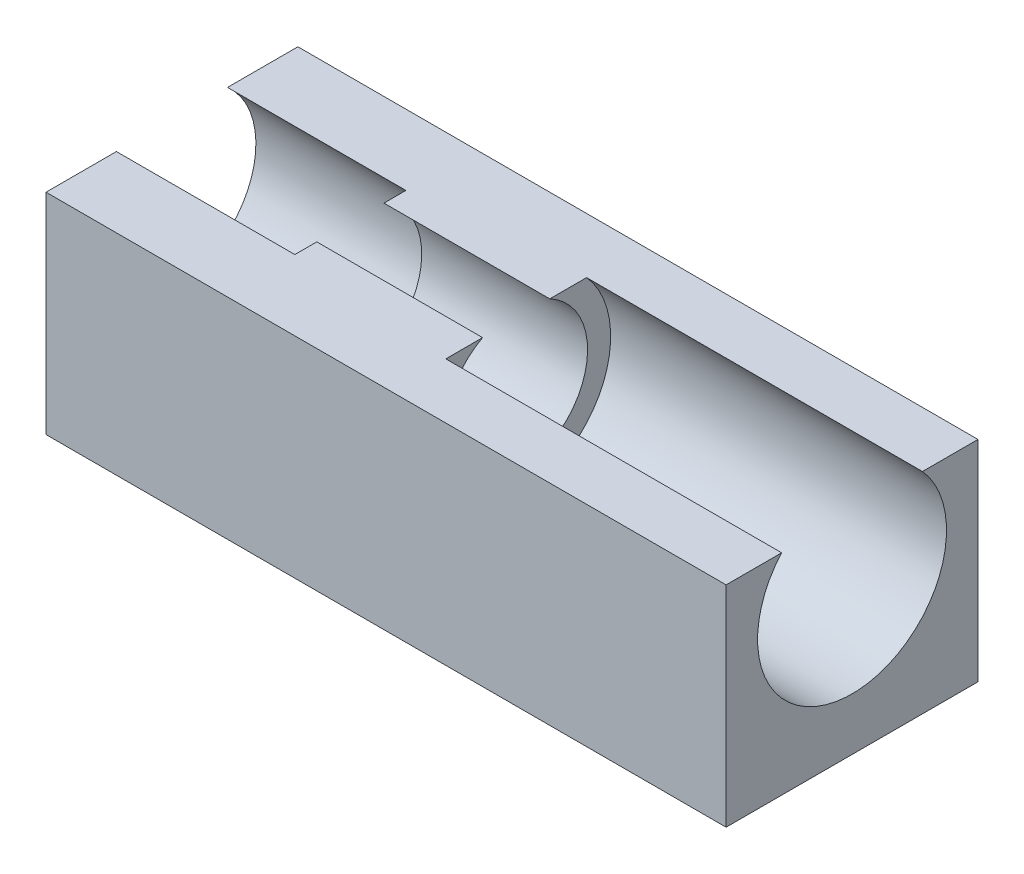
ISO-10303-21;
HEADER;
FILE_DESCRIPTION(('STEP AP214'),'2;1');
FILE_NAME('part.step','',(''),(''),'','','');
FILE_SCHEMA(('AUTOMOTIVE_DESIGN { 1 0 10303 214 1 1 1 1 }'));
ENDSEC;
DATA;
#1=APPLICATION_CONTEXT('core data for automotive mechanical design processes');
#2=APPLICATION_PROTOCOL_DEFINITION('international standard','automotive_design',2000,#1);
#3=PRODUCT_CONTEXT('',#1,'mechanical');
#4=PRODUCT('Part','Part','',(#3));
#5=PRODUCT_RELATED_PRODUCT_CATEGORY('part','',(#4));
#6=PRODUCT_DEFINITION_FORMATION('','',#4);
#7=PRODUCT_DEFINITION_CONTEXT('part definition',#1,'design');
#8=PRODUCT_DEFINITION('design','',#6,#7);
#9=PRODUCT_DEFINITION_SHAPE('','',#8);
#10=(LENGTH_UNIT() NAMED_UNIT(*) SI_UNIT(.MILLI.,.METRE.));
#11=(NAMED_UNIT(*) PLANE_ANGLE_UNIT() SI_UNIT($,.RADIAN.));
#12=(NAMED_UNIT(*) SI_UNIT($,.STERADIAN.) SOLID_ANGLE_UNIT());
#13=UNCERTAINTY_MEASURE_WITH_UNIT(LENGTH_MEASURE(1.E-05),#10,'distance_accuracy_value','');
#14=(GEOMETRIC_REPRESENTATION_CONTEXT(3) GLOBAL_UNCERTAINTY_ASSIGNED_CONTEXT((#13)) GLOBAL_UNIT_ASSIGNED_CONTEXT((#10,
#11,#12)) REPRESENTATION_CONTEXT('',''));
#15=CARTESIAN_POINT('',(0.,0.,0.));
#16=DIRECTION('',(0.,0.,1.));
#17=DIRECTION('',(1.,0.,0.));
#18=AXIS2_PLACEMENT_3D('',#15,#16,#17);
#19=CARTESIAN_POINT('',(0.,10.,0.));
#20=DIRECTION('',(0.,1.,0.));
#21=DIRECTION('',(0.,0.,1.));
#22=AXIS2_PLACEMENT_3D('',#19,#20,#21);
#23=PLANE('',#22);
#24=DIRECTION('',(1.,0.,0.));
#25=VECTOR('',#24,1.);
#26=CARTESIAN_POINT('',(0.199999999999991,10.,3.35410196624969));
#27=LINE('',#26,#25);
#28=CARTESIAN_POINT('',(0.199999999999991,10.,3.35410196624969));
#29=VERTEX_POINT('',#28);
#30=CARTESIAN_POINT('',(16.2,10.,3.35410196624969));
#31=VERTEX_POINT('',#30);
#32=EDGE_CURVE('E11',#29,#31,#27,.T.);
#33=ORIENTED_EDGE('',*,*,#32,.F.);
#34=DIRECTION('',(0.,0.,-1.));
#35=VECTOR('',#34,1.);
#36=CARTESIAN_POINT('',(0.199999999999992,10.,0.));
#37=LINE('',#36,#35);
#38=CARTESIAN_POINT('',(0.199999999999991,10.,1.6));
#39=VERTEX_POINT('',#38);
#40=EDGE_CURVE('E126',#29,#39,#37,.T.);
#41=ORIENTED_EDGE('',*,*,#40,.T.);
#42=DIRECTION('',(-1.,0.,0.));
#43=VECTOR('',#42,1.);
#44=CARTESIAN_POINT('',(0.199999999999999,10.,1.6));
#45=LINE('',#44,#43);
#46=CARTESIAN_POINT('',(-7.7,10.,1.6));
#47=VERTEX_POINT('',#46);
#48=EDGE_CURVE('E135',#47,#39,#45,.F.);
#49=ORIENTED_EDGE('',*,*,#48,.F.);
#50=DIRECTION('',(0.,0.,1.));
#51=VECTOR('',#50,1.);
#52=CARTESIAN_POINT('',(-7.7,10.,0.));
#53=LINE('',#52,#51);
#54=CARTESIAN_POINT('',(-7.7,10.,2.64575131106459));
#55=VERTEX_POINT('',#54);
#56=EDGE_CURVE('E56',#47,#55,#53,.T.);
#57=ORIENTED_EDGE('',*,*,#56,.T.);
#58=DIRECTION('',(-1.,0.,0.));
#59=VECTOR('',#58,1.);
#60=CARTESIAN_POINT('',(-7.7,10.,2.64575131106459));
#61=LINE('',#60,#59);
#62=CARTESIAN_POINT('',(-16.2,10.,2.64575131106459));
#63=VERTEX_POINT('',#62);
#64=EDGE_CURVE('E178',#63,#55,#61,.F.);
#65=ORIENTED_EDGE('',*,*,#64,.F.);
#66=DIRECTION('',(0.,0.,1.));
#67=VECTOR('',#66,1.);
#68=CARTESIAN_POINT('',(-16.2,10.,-6.));
#69=LINE('',#68,#67);
#70=CARTESIAN_POINT('',(-16.2,10.,6.));
#71=VERTEX_POINT('',#70);
#72=EDGE_CURVE('E150',#63,#71,#69,.T.);
#73=ORIENTED_EDGE('',*,*,#72,.T.);
#74=DIRECTION('',(1.,0.,0.));
#75=VECTOR('',#74,1.);
#76=CARTESIAN_POINT('',(-16.2,10.,6.));
#77=LINE('',#76,#75);
#78=CARTESIAN_POINT('',(16.2,10.,6.));
#79=VERTEX_POINT('',#78);
#80=EDGE_CURVE('E154',#71,#79,#77,.T.);
#81=ORIENTED_EDGE('',*,*,#80,.T.);
#82=DIRECTION('',(0.,0.,-1.));
#83=VECTOR('',#82,1.);
#84=CARTESIAN_POINT('',(16.2,10.,-6.));
#85=LINE('',#84,#83);
#86=EDGE_CURVE('E144',#79,#31,#85,.T.);
#87=ORIENTED_EDGE('',*,*,#86,.T.);
#88=EDGE_LOOP('',(#33,#41,#49,#57,#65,#73,#81,#87));
#89=FACE_BOUND('',#88,.T.);
#90=ADVANCED_FACE('F33',(#89),#23,.T.);
#91=CARTESIAN_POINT('',(16.2,10.,-6.));
#92=DIRECTION('',(-1.,0.,0.));
#93=DIRECTION('',(0.,0.,1.));
#94=AXIS2_PLACEMENT_3D('',#91,#92,#93);
#95=PLANE('',#94);
#96=CARTESIAN_POINT('',(16.2,10.,-3.35410196624967));
#97=VERTEX_POINT('',#96);
#98=CARTESIAN_POINT('',(16.2,10.,-6.));
#99=VERTEX_POINT('',#98);
#100=EDGE_CURVE('E148',#97,#99,#85,.T.);
#101=ORIENTED_EDGE('',*,*,#100,.F.);
#102=CARTESIAN_POINT('',(16.2,7.,0.));
#103=DIRECTION('',(1.,0.,0.));
#104=DIRECTION('',(0.,0.,-1.));
#105=AXIS2_PLACEMENT_3D('',#102,#103,#104);
#106=CIRCLE('',#105,4.5);
#107=EDGE_CURVE('E117',#31,#97,#106,.T.);
#108=ORIENTED_EDGE('',*,*,#107,.F.);
#109=ORIENTED_EDGE('',*,*,#86,.F.);
#110=DIRECTION('',(0.,-1.,0.));
#111=VECTOR('',#110,1.);
#112=CARTESIAN_POINT('',(16.2,10.,6.));
#113=LINE('',#112,#111);
#114=CARTESIAN_POINT('',(16.2,0.,6.));
#115=VERTEX_POINT('',#114);
#116=EDGE_CURVE('E156',#79,#115,#113,.T.);
#117=ORIENTED_EDGE('',*,*,#116,.T.);
#118=DIRECTION('',(0.,0.,-1.));
#119=VECTOR('',#118,1.);
#120=CARTESIAN_POINT('',(16.2,0.,-6.));
#121=LINE('',#120,#119);
#122=CARTESIAN_POINT('',(16.2,0.,-6.));
#123=VERTEX_POINT('',#122);
#124=EDGE_CURVE('E142',#115,#123,#121,.T.);
#125=ORIENTED_EDGE('',*,*,#124,.T.);
#126=DIRECTION('',(0.,-1.,0.));
#127=VECTOR('',#126,1.);
#128=CARTESIAN_POINT('',(16.2,10.,-6.));
#129=LINE('',#128,#127);
#130=EDGE_CURVE('E173',#99,#123,#129,.T.);
#131=ORIENTED_EDGE('',*,*,#130,.F.);
#132=EDGE_LOOP('',(#101,#108,#109,#117,#125,#131));
#133=FACE_BOUND('',#132,.T.);
#134=ADVANCED_FACE('F35',(#133),#95,.F.);
#135=CARTESIAN_POINT('',(-16.2,10.,-6.));
#136=DIRECTION('',(0.,0.,1.));
#137=DIRECTION('',(1.,0.,0.));
#138=AXIS2_PLACEMENT_3D('',#135,#136,#137);
#139=PLANE('',#138);
#140=DIRECTION('',(-1.,0.,0.));
#141=VECTOR('',#140,1.);
#142=CARTESIAN_POINT('',(-16.2,0.,-6.));
#143=LINE('',#142,#141);
#144=CARTESIAN_POINT('',(-16.2,0.,-6.));
#145=VERTEX_POINT('',#144);
#146=EDGE_CURVE('E159',#123,#145,#143,.T.);
#147=ORIENTED_EDGE('',*,*,#146,.T.);
#148=DIRECTION('',(0.,-1.,0.));
#149=VECTOR('',#148,1.);
#150=CARTESIAN_POINT('',(-16.2,10.,-6.));
#151=LINE('',#150,#149);
#152=CARTESIAN_POINT('',(-16.2,10.,-6.));
#153=VERTEX_POINT('',#152);
#154=EDGE_CURVE('E170',#153,#145,#151,.T.);
#155=ORIENTED_EDGE('',*,*,#154,.F.);
#156=DIRECTION('',(-1.,0.,0.));
#157=VECTOR('',#156,1.);
#158=CARTESIAN_POINT('',(-16.2,10.,-6.));
#159=LINE('',#158,#157);
#160=EDGE_CURVE('E147',#99,#153,#159,.T.);
#161=ORIENTED_EDGE('',*,*,#160,.F.);
#162=ORIENTED_EDGE('',*,*,#130,.T.);
#163=EDGE_LOOP('',(#147,#155,#161,#162));
#164=FACE_BOUND('',#163,.T.);
#165=ADVANCED_FACE('F209',(#164),#139,.F.);
#166=CARTESIAN_POINT('',(-16.2,10.,-6.));
#167=DIRECTION('',(1.,0.,0.));
#168=DIRECTION('',(0.,0.,-1.));
#169=AXIS2_PLACEMENT_3D('',#166,#167,#168);
#170=PLANE('',#169);
#171=ORIENTED_EDGE('',*,*,#72,.F.);
#172=CARTESIAN_POINT('',(-16.2,7.,0.));
#173=DIRECTION('',(-1.,0.,0.));
#174=DIRECTION('',(0.,0.,1.));
#175=AXIS2_PLACEMENT_3D('',#172,#173,#174);
#176=CIRCLE('',#175,4.);
#177=CARTESIAN_POINT('',(-16.2,10.,-2.64575131106459));
#178=VERTEX_POINT('',#177);
#179=EDGE_CURVE('E139',#178,#63,#176,.T.);
#180=ORIENTED_EDGE('',*,*,#179,.F.);
#181=EDGE_CURVE('E151',#153,#178,#69,.T.);
#182=ORIENTED_EDGE('',*,*,#181,.F.);
#183=ORIENTED_EDGE('',*,*,#154,.T.);
#184=DIRECTION('',(0.,0.,1.));
#185=VECTOR('',#184,1.);
#186=CARTESIAN_POINT('',(-16.2,0.,-6.));
#187=LINE('',#186,#185);
#188=CARTESIAN_POINT('',(-16.2,0.,6.));
#189=VERTEX_POINT('',#188);
#190=EDGE_CURVE('E161',#145,#189,#187,.T.);
#191=ORIENTED_EDGE('',*,*,#190,.T.);
#192=DIRECTION('',(0.,-1.,0.));
#193=VECTOR('',#192,1.);
#194=CARTESIAN_POINT('',(-16.2,10.,6.));
#195=LINE('',#194,#193);
#196=EDGE_CURVE('E167',#71,#189,#195,.T.);
#197=ORIENTED_EDGE('',*,*,#196,.F.);
#198=EDGE_LOOP('',(#171,#180,#182,#183,#191,#197));
#199=FACE_BOUND('',#198,.T.);
#200=ADVANCED_FACE('F194',(#199),#170,.F.);
#201=CARTESIAN_POINT('',(-16.2,10.,6.));
#202=DIRECTION('',(0.,0.,-1.));
#203=DIRECTION('',(-1.,0.,0.));
#204=AXIS2_PLACEMENT_3D('',#201,#202,#203);
#205=PLANE('',#204);
#206=DIRECTION('',(1.,0.,0.));
#207=VECTOR('',#206,1.);
#208=CARTESIAN_POINT('',(-16.2,0.,6.));
#209=LINE('',#208,#207);
#210=EDGE_CURVE('E163',#189,#115,#209,.T.);
#211=ORIENTED_EDGE('',*,*,#210,.T.);
#212=ORIENTED_EDGE('',*,*,#116,.F.);
#213=ORIENTED_EDGE('',*,*,#80,.F.);
#214=ORIENTED_EDGE('',*,*,#196,.T.);
#215=EDGE_LOOP('',(#211,#212,#213,#214));
#216=FACE_BOUND('',#215,.T.);
#217=ADVANCED_FACE('F201',(#216),#205,.F.);
#218=DIRECTION('',(1.,0.,0.));
#219=VECTOR('',#218,1.);
#220=CARTESIAN_POINT('',(0.199999999999993,10.,-3.35410196624968));
#221=LINE('',#220,#219);
#222=CARTESIAN_POINT('',(0.199999999999993,10.,-3.35410196624968));
#223=VERTEX_POINT('',#222);
#224=EDGE_CURVE('E41',#97,#223,#221,.F.);
#225=ORIENTED_EDGE('',*,*,#224,.F.);
#226=ORIENTED_EDGE('',*,*,#100,.T.);
#227=ORIENTED_EDGE('',*,*,#160,.T.);
#228=ORIENTED_EDGE('',*,*,#181,.T.);
#229=DIRECTION('',(-1.,0.,0.));
#230=VECTOR('',#229,1.);
#231=CARTESIAN_POINT('',(-7.7,10.,-2.64575131106459));
#232=LINE('',#231,#230);
#233=CARTESIAN_POINT('',(-7.7,10.,-2.64575131106459));
#234=VERTEX_POINT('',#233);
#235=EDGE_CURVE('E181',#234,#178,#232,.T.);
#236=ORIENTED_EDGE('',*,*,#235,.F.);
#237=CARTESIAN_POINT('',(-7.7,10.,-1.6));
#238=VERTEX_POINT('',#237);
#239=EDGE_CURVE('E176',#234,#238,#53,.T.);
#240=ORIENTED_EDGE('',*,*,#239,.T.);
#241=DIRECTION('',(-1.,0.,0.));
#242=VECTOR('',#241,1.);
#243=CARTESIAN_POINT('',(0.199999999999999,10.,-1.6));
#244=LINE('',#243,#242);
#245=CARTESIAN_POINT('',(0.199999999999999,10.,-1.6));
#246=VERTEX_POINT('',#245);
#247=EDGE_CURVE('E48',#246,#238,#244,.T.);
#248=ORIENTED_EDGE('',*,*,#247,.F.);
#249=EDGE_CURVE('E124',#246,#223,#37,.T.);
#250=ORIENTED_EDGE('',*,*,#249,.T.);
#251=EDGE_LOOP('',(#225,#226,#227,#228,#236,#240,#248,#250));
#252=FACE_BOUND('',#251,.T.);
#253=ADVANCED_FACE('F128',(#252),#23,.T.);
#254=CARTESIAN_POINT('',(0.,0.,0.));
#255=DIRECTION('',(0.,1.,0.));
#256=DIRECTION('',(0.,0.,1.));
#257=AXIS2_PLACEMENT_3D('',#254,#255,#256);
#258=PLANE('',#257);
#259=ORIENTED_EDGE('',*,*,#124,.F.);
#260=ORIENTED_EDGE('',*,*,#210,.F.);
#261=ORIENTED_EDGE('',*,*,#190,.F.);
#262=ORIENTED_EDGE('',*,*,#146,.F.);
#263=EDGE_LOOP('',(#259,#260,#261,#262));
#264=FACE_BOUND('',#263,.T.);
#265=ADVANCED_FACE('F211',(#264),#258,.F.);
#266=CARTESIAN_POINT('',(-7.7,7.,0.));
#267=DIRECTION('',(-1.,0.,0.));
#268=DIRECTION('',(0.,0.,1.));
#269=AXIS2_PLACEMENT_3D('',#266,#267,#268);
#270=CYLINDRICAL_SURFACE('',#269,4.);
#271=ORIENTED_EDGE('',*,*,#235,.T.);
#272=ORIENTED_EDGE('',*,*,#179,.T.);
#273=ORIENTED_EDGE('',*,*,#64,.T.);
#274=CARTESIAN_POINT('',(-7.7,7.,0.));
#275=DIRECTION('',(-1.,0.,0.));
#276=DIRECTION('',(0.,0.,1.));
#277=AXIS2_PLACEMENT_3D('',#274,#275,#276);
#278=CIRCLE('',#277,4.);
#279=EDGE_CURVE('E140',#234,#55,#278,.T.);
#280=ORIENTED_EDGE('',*,*,#279,.F.);
#281=EDGE_LOOP('',(#271,#272,#273,#280));
#282=FACE_BOUND('',#281,.T.);
#283=ADVANCED_FACE('F189',(#282),#270,.F.);
#284=CARTESIAN_POINT('',(-7.7,7.,0.));
#285=DIRECTION('',(-1.,0.,0.));
#286=DIRECTION('',(0.,0.,1.));
#287=AXIS2_PLACEMENT_3D('',#284,#285,#286);
#288=PLANE('',#287);
#289=CARTESIAN_POINT('',(-7.7,7.,0.));
#290=DIRECTION('',(-1.,0.,0.));
#291=DIRECTION('',(0.,0.,1.));
#292=AXIS2_PLACEMENT_3D('',#289,#290,#291);
#293=CIRCLE('',#292,3.4);
#294=EDGE_CURVE('E121',#238,#47,#293,.T.);
#295=ORIENTED_EDGE('',*,*,#294,.F.);
#296=ORIENTED_EDGE('',*,*,#239,.F.);
#297=ORIENTED_EDGE('',*,*,#279,.T.);
#298=ORIENTED_EDGE('',*,*,#56,.F.);
#299=EDGE_LOOP('',(#295,#296,#297,#298));
#300=FACE_BOUND('',#299,.T.);
#301=ADVANCED_FACE('F185',(#300),#288,.T.);
#302=CARTESIAN_POINT('',(0.199999999999999,7.,0.));
#303=DIRECTION('',(-1.,0.,0.));
#304=DIRECTION('',(0.,0.,1.));
#305=AXIS2_PLACEMENT_3D('',#302,#303,#304);
#306=CYLINDRICAL_SURFACE('',#305,3.4);
#307=ORIENTED_EDGE('',*,*,#247,.T.);
#308=ORIENTED_EDGE('',*,*,#294,.T.);
#309=ORIENTED_EDGE('',*,*,#48,.T.);
#310=CARTESIAN_POINT('',(0.199999999999999,7.,0.));
#311=DIRECTION('',(-1.,0.,0.));
#312=DIRECTION('',(0.,0.,1.));
#313=AXIS2_PLACEMENT_3D('',#310,#311,#312);
#314=CIRCLE('',#313,3.4);
#315=EDGE_CURVE('E131',#246,#39,#314,.T.);
#316=ORIENTED_EDGE('',*,*,#315,.F.);
#317=EDGE_LOOP('',(#307,#308,#309,#316));
#318=FACE_BOUND('',#317,.T.);
#319=ADVANCED_FACE('F183',(#318),#306,.F.);
#320=CARTESIAN_POINT('',(0.199999999999992,7.,0.));
#321=DIRECTION('',(1.,0.,0.));
#322=DIRECTION('',(0.,0.,-1.));
#323=AXIS2_PLACEMENT_3D('',#320,#321,#322);
#324=PLANE('',#323);
#325=CARTESIAN_POINT('',(0.199999999999992,7.,0.));
#326=DIRECTION('',(1.,0.,0.));
#327=DIRECTION('',(0.,0.,-1.));
#328=AXIS2_PLACEMENT_3D('',#325,#326,#327);
#329=CIRCLE('',#328,4.5);
#330=EDGE_CURVE('E114',#29,#223,#329,.T.);
#331=ORIENTED_EDGE('',*,*,#330,.T.);
#332=ORIENTED_EDGE('',*,*,#249,.F.);
#333=ORIENTED_EDGE('',*,*,#315,.T.);
#334=ORIENTED_EDGE('',*,*,#40,.F.);
#335=EDGE_LOOP('',(#331,#332,#333,#334));
#336=FACE_BOUND('',#335,.T.);
#337=ADVANCED_FACE('F123',(#336),#324,.T.);
#338=CARTESIAN_POINT('',(0.199999999999992,7.,0.));
#339=DIRECTION('',(1.,0.,0.));
#340=DIRECTION('',(0.,0.,-1.));
#341=AXIS2_PLACEMENT_3D('',#338,#339,#340);
#342=CYLINDRICAL_SURFACE('',#341,4.5);
#343=ORIENTED_EDGE('',*,*,#32,.T.);
#344=ORIENTED_EDGE('',*,*,#107,.T.);
#345=ORIENTED_EDGE('',*,*,#224,.T.);
#346=ORIENTED_EDGE('',*,*,#330,.F.);
#347=EDGE_LOOP('',(#343,#344,#345,#346));
#348=FACE_BOUND('',#347,.T.);
#349=ADVANCED_FACE('F113',(#348),#342,.F.);
#350=CLOSED_SHELL('',(#90,#134,#165,#200,#217,#253,#265,#283,#301,#319,#337,#349));
#351=MANIFOLD_SOLID_BREP('B2',#350);
#352=ADVANCED_BREP_SHAPE_REPRESENTATION('',(#18,#351),#14);
#353=SHAPE_DEFINITION_REPRESENTATION(#9,#352);
ENDSEC;
END-ISO-10303-21;
